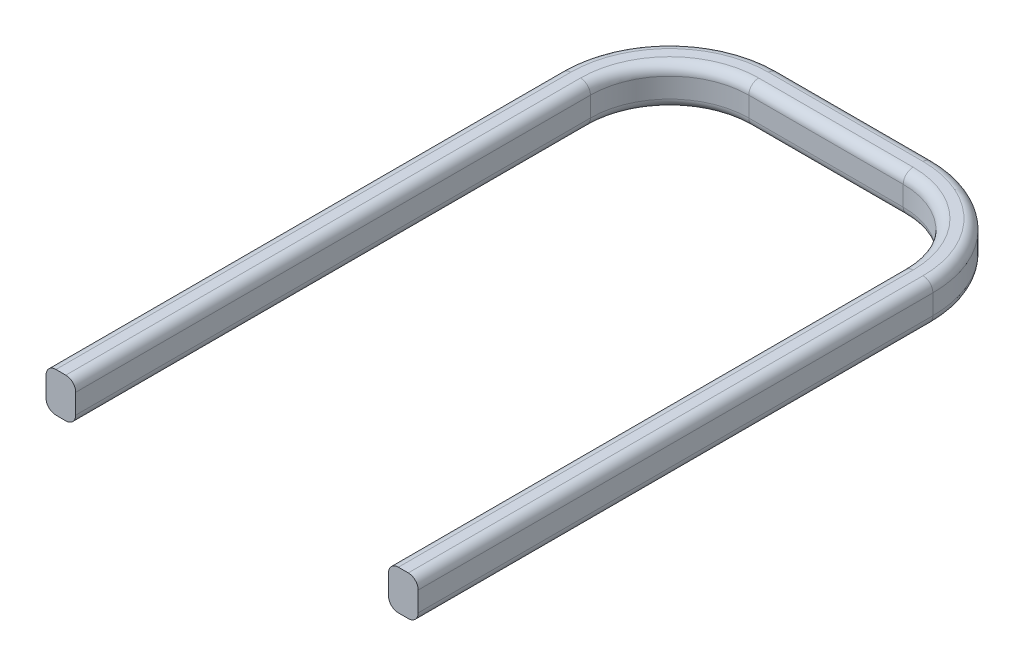
ISO-10303-21;
HEADER;
FILE_DESCRIPTION(('STEP AP214'),'2;1');
FILE_NAME('part.step','',(''),(''),'','','');
FILE_SCHEMA(('AUTOMOTIVE_DESIGN { 1 0 10303 214 1 1 1 1 }'));
ENDSEC;
DATA;
#1=APPLICATION_CONTEXT('core data for automotive mechanical design processes');
#2=APPLICATION_PROTOCOL_DEFINITION('international standard','automotive_design',2000,#1);
#3=PRODUCT_CONTEXT('',#1,'mechanical');
#4=PRODUCT('Part','Part','',(#3));
#5=PRODUCT_RELATED_PRODUCT_CATEGORY('part','',(#4));
#6=PRODUCT_DEFINITION_FORMATION('','',#4);
#7=PRODUCT_DEFINITION_CONTEXT('part definition',#1,'design');
#8=PRODUCT_DEFINITION('design','',#6,#7);
#9=PRODUCT_DEFINITION_SHAPE('','',#8);
#10=(LENGTH_UNIT() NAMED_UNIT(*) SI_UNIT(.MILLI.,.METRE.));
#11=(NAMED_UNIT(*) PLANE_ANGLE_UNIT() SI_UNIT($,.RADIAN.));
#12=(NAMED_UNIT(*) SI_UNIT($,.STERADIAN.) SOLID_ANGLE_UNIT());
#13=UNCERTAINTY_MEASURE_WITH_UNIT(LENGTH_MEASURE(1.E-05),#10,'distance_accuracy_value','');
#14=(GEOMETRIC_REPRESENTATION_CONTEXT(3) GLOBAL_UNCERTAINTY_ASSIGNED_CONTEXT((#13)) GLOBAL_UNIT_ASSIGNED_CONTEXT((#10,
#11,#12)) REPRESENTATION_CONTEXT('',''));
#15=CARTESIAN_POINT('',(0.,0.,0.));
#16=DIRECTION('',(0.,0.,1.));
#17=DIRECTION('',(1.,0.,0.));
#18=AXIS2_PLACEMENT_3D('',#15,#16,#17);
#19=CARTESIAN_POINT('',(-4.7,1.,0.));
#20=DIRECTION('',(0.,0.,-1.));
#21=DIRECTION('',(-1.,0.,0.));
#22=AXIS2_PLACEMENT_3D('',#19,#20,#21);
#23=PLANE('',#22);
#24=DIRECTION('',(1.,0.,0.));
#25=VECTOR('',#24,1.);
#26=CARTESIAN_POINT('',(-4.7,0.,0.));
#27=LINE('',#26,#25);
#28=CARTESIAN_POINT('',(-4.45,0.,0.));
#29=VERTEX_POINT('',#28);
#30=CARTESIAN_POINT('',(-4.2,0.,0.));
#31=VERTEX_POINT('',#30);
#32=EDGE_CURVE('E313',#29,#31,#27,.T.);
#33=ORIENTED_EDGE('',*,*,#32,.T.);
#34=CARTESIAN_POINT('',(-4.2,0.25,0.));
#35=DIRECTION('',(0.,0.,-1.));
#36=DIRECTION('',(-1.,0.,0.));
#37=AXIS2_PLACEMENT_3D('',#34,#35,#36);
#38=CIRCLE('',#37,0.25);
#39=CARTESIAN_POINT('',(-3.95,0.25,0.));
#40=VERTEX_POINT('',#39);
#41=EDGE_CURVE('E207',#31,#40,#38,.F.);
#42=ORIENTED_EDGE('',*,*,#41,.T.);
#43=DIRECTION('',(0.,-1.,0.));
#44=VECTOR('',#43,1.);
#45=CARTESIAN_POINT('',(-3.95,1.,0.));
#46=LINE('',#45,#44);
#47=CARTESIAN_POINT('',(-3.95,0.75,0.));
#48=VERTEX_POINT('',#47);
#49=EDGE_CURVE('E218',#48,#40,#46,.T.);
#50=ORIENTED_EDGE('',*,*,#49,.F.);
#51=CARTESIAN_POINT('',(-4.2,0.75,0.));
#52=DIRECTION('',(0.,0.,-1.));
#53=DIRECTION('',(-1.,0.,0.));
#54=AXIS2_PLACEMENT_3D('',#51,#52,#53);
#55=CIRCLE('',#54,0.25);
#56=CARTESIAN_POINT('',(-4.2,1.,0.));
#57=VERTEX_POINT('',#56);
#58=EDGE_CURVE('E226',#48,#57,#55,.F.);
#59=ORIENTED_EDGE('',*,*,#58,.T.);
#60=DIRECTION('',(1.,0.,0.));
#61=VECTOR('',#60,1.);
#62=CARTESIAN_POINT('',(-4.7,1.,0.));
#63=LINE('',#62,#61);
#64=CARTESIAN_POINT('',(-4.45,1.,0.));
#65=VERTEX_POINT('',#64);
#66=EDGE_CURVE('E324',#65,#57,#63,.T.);
#67=ORIENTED_EDGE('',*,*,#66,.F.);
#68=CARTESIAN_POINT('',(-4.45,0.75,0.));
#69=DIRECTION('',(0.,0.,-1.));
#70=DIRECTION('',(-1.,0.,0.));
#71=AXIS2_PLACEMENT_3D('',#68,#69,#70);
#72=CIRCLE('',#71,0.25);
#73=CARTESIAN_POINT('',(-4.7,0.75,0.));
#74=VERTEX_POINT('',#73);
#75=EDGE_CURVE('E380',#65,#74,#72,.F.);
#76=ORIENTED_EDGE('',*,*,#75,.T.);
#77=DIRECTION('',(0.,-1.,0.));
#78=VECTOR('',#77,1.);
#79=CARTESIAN_POINT('',(-4.7,1.,0.));
#80=LINE('',#79,#78);
#81=CARTESIAN_POINT('',(-4.7,0.25,0.));
#82=VERTEX_POINT('',#81);
#83=EDGE_CURVE('E330',#74,#82,#80,.T.);
#84=ORIENTED_EDGE('',*,*,#83,.T.);
#85=CARTESIAN_POINT('',(-4.45,0.25,0.));
#86=DIRECTION('',(0.,0.,-1.));
#87=DIRECTION('',(-1.,0.,0.));
#88=AXIS2_PLACEMENT_3D('',#85,#86,#87);
#89=CIRCLE('',#88,0.25);
#90=EDGE_CURVE('E382',#82,#29,#89,.F.);
#91=ORIENTED_EDGE('',*,*,#90,.T.);
#92=EDGE_LOOP('',(#33,#42,#50,#59,#67,#76,#84,#91));
#93=FACE_BOUND('',#92,.T.);
#94=ADVANCED_FACE('F32',(#93),#23,.F.);
#95=CARTESIAN_POINT('',(-3.95,1.,0.));
#96=DIRECTION('',(-1.,0.,0.));
#97=DIRECTION('',(0.,0.,1.));
#98=AXIS2_PLACEMENT_3D('',#95,#96,#97);
#99=PLANE('',#98);
#100=ORIENTED_EDGE('',*,*,#49,.T.);
#101=DIRECTION('',(0.,0.,-1.));
#102=VECTOR('',#101,1.);
#103=CARTESIAN_POINT('',(-3.95,0.25,-13.));
#104=LINE('',#103,#102);
#105=CARTESIAN_POINT('',(-3.95,0.25,-13.));
#106=VERTEX_POINT('',#105);
#107=EDGE_CURVE('E217',#40,#106,#104,.T.);
#108=ORIENTED_EDGE('',*,*,#107,.T.);
#109=DIRECTION('',(0.,-1.,0.));
#110=VECTOR('',#109,1.);
#111=CARTESIAN_POINT('',(-3.95,1.,-13.));
#112=LINE('',#111,#110);
#113=CARTESIAN_POINT('',(-3.95,0.75,-13.));
#114=VERTEX_POINT('',#113);
#115=EDGE_CURVE('E199',#114,#106,#112,.T.);
#116=ORIENTED_EDGE('',*,*,#115,.F.);
#117=DIRECTION('',(0.,0.,-1.));
#118=VECTOR('',#117,1.);
#119=CARTESIAN_POINT('',(-3.95,0.75,0.));
#120=LINE('',#119,#118);
#121=EDGE_CURVE('E214',#114,#48,#120,.F.);
#122=ORIENTED_EDGE('',*,*,#121,.T.);
#123=EDGE_LOOP('',(#100,#108,#116,#122));
#124=FACE_BOUND('',#123,.T.);
#125=ADVANCED_FACE('F213',(#124),#99,.F.);
#126=CARTESIAN_POINT('',(-1.95,1.,-13.));
#127=DIRECTION('',(0.,-1.,0.));
#128=DIRECTION('',(0.,0.,-1.));
#129=AXIS2_PLACEMENT_3D('',#126,#127,#128);
#130=CYLINDRICAL_SURFACE('',#129,2.);
#131=ORIENTED_EDGE('',*,*,#115,.T.);
#132=CARTESIAN_POINT('',(-1.95,0.25,-13.));
#133=DIRECTION('',(0.,-1.,0.));
#134=DIRECTION('',(0.,0.,-1.));
#135=AXIS2_PLACEMENT_3D('',#132,#133,#134);
#136=CIRCLE('',#135,2.);
#137=CARTESIAN_POINT('',(-1.95,0.25,-15.));
#138=VERTEX_POINT('',#137);
#139=EDGE_CURVE('E206',#106,#138,#136,.T.);
#140=ORIENTED_EDGE('',*,*,#139,.T.);
#141=DIRECTION('',(0.,-1.,0.));
#142=VECTOR('',#141,1.);
#143=CARTESIAN_POINT('',(-1.95,1.,-15.));
#144=LINE('',#143,#142);
#145=CARTESIAN_POINT('',(-1.95,0.75,-15.));
#146=VERTEX_POINT('',#145);
#147=EDGE_CURVE('E201',#146,#138,#144,.T.);
#148=ORIENTED_EDGE('',*,*,#147,.F.);
#149=CARTESIAN_POINT('',(-1.95,0.75,-13.));
#150=DIRECTION('',(0.,-1.,0.));
#151=DIRECTION('',(0.,0.,-1.));
#152=AXIS2_PLACEMENT_3D('',#149,#150,#151);
#153=CIRCLE('',#152,2.);
#154=EDGE_CURVE('E196',#146,#114,#153,.F.);
#155=ORIENTED_EDGE('',*,*,#154,.T.);
#156=EDGE_LOOP('',(#131,#140,#148,#155));
#157=FACE_BOUND('',#156,.T.);
#158=ADVANCED_FACE('F198',(#157),#130,.F.);
#159=CARTESIAN_POINT('',(-1.94999999999999,1.,-15.));
#160=DIRECTION('',(0.,0.,-1.));
#161=DIRECTION('',(-1.,0.,0.));
#162=AXIS2_PLACEMENT_3D('',#159,#160,#161);
#163=PLANE('',#162);
#164=ORIENTED_EDGE('',*,*,#147,.T.);
#165=DIRECTION('',(1.,0.,0.));
#166=VECTOR('',#165,1.);
#167=CARTESIAN_POINT('',(1.94999999999999,0.25,-15.));
#168=LINE('',#167,#166);
#169=CARTESIAN_POINT('',(1.94999999999999,0.25,-15.));
#170=VERTEX_POINT('',#169);
#171=EDGE_CURVE('E388',#138,#170,#168,.T.);
#172=ORIENTED_EDGE('',*,*,#171,.T.);
#173=DIRECTION('',(0.,-1.,0.));
#174=VECTOR('',#173,1.);
#175=CARTESIAN_POINT('',(1.94999999999999,1.,-15.));
#176=LINE('',#175,#174);
#177=CARTESIAN_POINT('',(1.94999999999999,0.75,-15.));
#178=VERTEX_POINT('',#177);
#179=EDGE_CURVE('E353',#178,#170,#176,.T.);
#180=ORIENTED_EDGE('',*,*,#179,.F.);
#181=DIRECTION('',(1.,0.,0.));
#182=VECTOR('',#181,1.);
#183=CARTESIAN_POINT('',(-1.94999999999999,0.75,-15.));
#184=LINE('',#183,#182);
#185=EDGE_CURVE('E386',#178,#146,#184,.F.);
#186=ORIENTED_EDGE('',*,*,#185,.T.);
#187=EDGE_LOOP('',(#164,#172,#180,#186));
#188=FACE_BOUND('',#187,.T.);
#189=ADVANCED_FACE('F459',(#188),#163,.F.);
#190=CARTESIAN_POINT('',(1.95,1.,-13.));
#191=DIRECTION('',(0.,-1.,0.));
#192=DIRECTION('',(0.,0.,-1.));
#193=AXIS2_PLACEMENT_3D('',#190,#191,#192);
#194=CYLINDRICAL_SURFACE('',#193,2.);
#195=ORIENTED_EDGE('',*,*,#179,.T.);
#196=CARTESIAN_POINT('',(1.95,0.25,-13.));
#197=DIRECTION('',(0.,-1.,0.));
#198=DIRECTION('',(0.,0.,-1.));
#199=AXIS2_PLACEMENT_3D('',#196,#197,#198);
#200=CIRCLE('',#199,2.);
#201=CARTESIAN_POINT('',(3.95,0.25,-13.));
#202=VERTEX_POINT('',#201);
#203=EDGE_CURVE('E392',#170,#202,#200,.T.);
#204=ORIENTED_EDGE('',*,*,#203,.T.);
#205=DIRECTION('',(0.,-1.,0.));
#206=VECTOR('',#205,1.);
#207=CARTESIAN_POINT('',(3.95,1.,-13.));
#208=LINE('',#207,#206);
#209=CARTESIAN_POINT('',(3.95,0.75,-13.));
#210=VERTEX_POINT('',#209);
#211=EDGE_CURVE('E350',#210,#202,#208,.T.);
#212=ORIENTED_EDGE('',*,*,#211,.F.);
#213=CARTESIAN_POINT('',(1.95,0.75,-13.));
#214=DIRECTION('',(0.,-1.,0.));
#215=DIRECTION('',(0.,0.,-1.));
#216=AXIS2_PLACEMENT_3D('',#213,#214,#215);
#217=CIRCLE('',#216,2.);
#218=EDGE_CURVE('E390',#210,#178,#217,.F.);
#219=ORIENTED_EDGE('',*,*,#218,.T.);
#220=EDGE_LOOP('',(#195,#204,#212,#219));
#221=FACE_BOUND('',#220,.T.);
#222=ADVANCED_FACE('F468',(#221),#194,.F.);
#223=CARTESIAN_POINT('',(3.95,1.,-13.));
#224=DIRECTION('',(1.,0.,0.));
#225=DIRECTION('',(0.,0.,-1.));
#226=AXIS2_PLACEMENT_3D('',#223,#224,#225);
#227=PLANE('',#226);
#228=ORIENTED_EDGE('',*,*,#211,.T.);
#229=DIRECTION('',(0.,0.,1.));
#230=VECTOR('',#229,1.);
#231=CARTESIAN_POINT('',(3.95,0.25,0.));
#232=LINE('',#231,#230);
#233=CARTESIAN_POINT('',(3.95,0.25,0.));
#234=VERTEX_POINT('',#233);
#235=EDGE_CURVE('E433',#202,#234,#232,.T.);
#236=ORIENTED_EDGE('',*,*,#235,.T.);
#237=DIRECTION('',(0.,-1.,0.));
#238=VECTOR('',#237,1.);
#239=CARTESIAN_POINT('',(3.95,1.,0.));
#240=LINE('',#239,#238);
#241=CARTESIAN_POINT('',(3.95,0.75,0.));
#242=VERTEX_POINT('',#241);
#243=EDGE_CURVE('E347',#242,#234,#240,.T.);
#244=ORIENTED_EDGE('',*,*,#243,.F.);
#245=DIRECTION('',(0.,0.,1.));
#246=VECTOR('',#245,1.);
#247=CARTESIAN_POINT('',(3.95,0.75,-13.));
#248=LINE('',#247,#246);
#249=EDGE_CURVE('E431',#242,#210,#248,.F.);
#250=ORIENTED_EDGE('',*,*,#249,.T.);
#251=EDGE_LOOP('',(#228,#236,#244,#250));
#252=FACE_BOUND('',#251,.T.);
#253=ADVANCED_FACE('F723',(#252),#227,.F.);
#254=CARTESIAN_POINT('',(3.95,1.,0.));
#255=DIRECTION('',(0.,0.,-1.));
#256=DIRECTION('',(-1.,0.,0.));
#257=AXIS2_PLACEMENT_3D('',#254,#255,#256);
#258=PLANE('',#257);
#259=ORIENTED_EDGE('',*,*,#243,.T.);
#260=CARTESIAN_POINT('',(4.2,0.25,0.));
#261=DIRECTION('',(0.,0.,-1.));
#262=DIRECTION('',(-1.,0.,0.));
#263=AXIS2_PLACEMENT_3D('',#260,#261,#262);
#264=CIRCLE('',#263,0.25);
#265=CARTESIAN_POINT('',(4.2,0.,0.));
#266=VERTEX_POINT('',#265);
#267=EDGE_CURVE('E440',#234,#266,#264,.F.);
#268=ORIENTED_EDGE('',*,*,#267,.T.);
#269=DIRECTION('',(1.,0.,0.));
#270=VECTOR('',#269,1.);
#271=CARTESIAN_POINT('',(3.95,0.,0.));
#272=LINE('',#271,#270);
#273=CARTESIAN_POINT('',(4.45,0.,0.));
#274=VERTEX_POINT('',#273);
#275=EDGE_CURVE('E319',#266,#274,#272,.T.);
#276=ORIENTED_EDGE('',*,*,#275,.T.);
#277=CARTESIAN_POINT('',(4.45,0.25,0.));
#278=DIRECTION('',(0.,0.,-1.));
#279=DIRECTION('',(-1.,0.,0.));
#280=AXIS2_PLACEMENT_3D('',#277,#278,#279);
#281=CIRCLE('',#280,0.25);
#282=CARTESIAN_POINT('',(4.7,0.25,0.));
#283=VERTEX_POINT('',#282);
#284=EDGE_CURVE('E49',#274,#283,#281,.F.);
#285=ORIENTED_EDGE('',*,*,#284,.T.);
#286=DIRECTION('',(0.,-1.,0.));
#287=VECTOR('',#286,1.);
#288=CARTESIAN_POINT('',(4.7,1.,0.));
#289=LINE('',#288,#287);
#290=CARTESIAN_POINT('',(4.7,0.75,0.));
#291=VERTEX_POINT('',#290);
#292=EDGE_CURVE('E345',#291,#283,#289,.T.);
#293=ORIENTED_EDGE('',*,*,#292,.F.);
#294=CARTESIAN_POINT('',(4.45,0.75,0.));
#295=DIRECTION('',(0.,0.,-1.));
#296=DIRECTION('',(-1.,0.,0.));
#297=AXIS2_PLACEMENT_3D('',#294,#295,#296);
#298=CIRCLE('',#297,0.25);
#299=CARTESIAN_POINT('',(4.45,1.,0.));
#300=VERTEX_POINT('',#299);
#301=EDGE_CURVE('E437',#291,#300,#298,.F.);
#302=ORIENTED_EDGE('',*,*,#301,.T.);
#303=DIRECTION('',(1.,0.,0.));
#304=VECTOR('',#303,1.);
#305=CARTESIAN_POINT('',(3.95,1.,0.));
#306=LINE('',#305,#304);
#307=CARTESIAN_POINT('',(4.2,1.,0.));
#308=VERTEX_POINT('',#307);
#309=EDGE_CURVE('E327',#308,#300,#306,.T.);
#310=ORIENTED_EDGE('',*,*,#309,.F.);
#311=CARTESIAN_POINT('',(4.2,0.75,0.));
#312=DIRECTION('',(0.,0.,-1.));
#313=DIRECTION('',(-1.,0.,0.));
#314=AXIS2_PLACEMENT_3D('',#311,#312,#313);
#315=CIRCLE('',#314,0.25);
#316=EDGE_CURVE('E435',#308,#242,#315,.F.);
#317=ORIENTED_EDGE('',*,*,#316,.T.);
#318=EDGE_LOOP('',(#259,#268,#276,#285,#293,#302,#310,#317));
#319=FACE_BOUND('',#318,.T.);
#320=ADVANCED_FACE('F443',(#319),#258,.F.);
#321=CARTESIAN_POINT('',(4.7,1.,-13.));
#322=DIRECTION('',(-1.,0.,0.));
#323=DIRECTION('',(0.,0.,1.));
#324=AXIS2_PLACEMENT_3D('',#321,#322,#323);
#325=PLANE('',#324);
#326=ORIENTED_EDGE('',*,*,#292,.T.);
#327=DIRECTION('',(0.,0.,-1.));
#328=VECTOR('',#327,1.);
#329=CARTESIAN_POINT('',(4.7,0.25,-13.));
#330=LINE('',#329,#328);
#331=CARTESIAN_POINT('',(4.7,0.25,-13.));
#332=VERTEX_POINT('',#331);
#333=EDGE_CURVE('E11',#283,#332,#330,.T.);
#334=ORIENTED_EDGE('',*,*,#333,.T.);
#335=DIRECTION('',(0.,-1.,0.));
#336=VECTOR('',#335,1.);
#337=CARTESIAN_POINT('',(4.7,1.,-13.));
#338=LINE('',#337,#336);
#339=CARTESIAN_POINT('',(4.7,0.75,-13.));
#340=VERTEX_POINT('',#339);
#341=EDGE_CURVE('E342',#340,#332,#338,.T.);
#342=ORIENTED_EDGE('',*,*,#341,.F.);
#343=DIRECTION('',(0.,0.,-1.));
#344=VECTOR('',#343,1.);
#345=CARTESIAN_POINT('',(4.7,0.75,-13.));
#346=LINE('',#345,#344);
#347=EDGE_CURVE('E41',#340,#291,#346,.F.);
#348=ORIENTED_EDGE('',*,*,#347,.T.);
#349=EDGE_LOOP('',(#326,#334,#342,#348));
#350=FACE_BOUND('',#349,.T.);
#351=ADVANCED_FACE('F708',(#350),#325,.F.);
#352=CARTESIAN_POINT('',(1.95,1.,-13.));
#353=DIRECTION('',(0.,-1.,0.));
#354=DIRECTION('',(0.,0.,-1.));
#355=AXIS2_PLACEMENT_3D('',#352,#353,#354);
#356=CYLINDRICAL_SURFACE('',#355,2.75);
#357=ORIENTED_EDGE('',*,*,#341,.T.);
#358=CARTESIAN_POINT('',(1.95,0.25,-13.));
#359=DIRECTION('',(0.,-1.,0.));
#360=DIRECTION('',(0.,0.,-1.));
#361=AXIS2_PLACEMENT_3D('',#358,#359,#360);
#362=CIRCLE('',#361,2.75);
#363=CARTESIAN_POINT('',(1.94999999999999,0.25,-15.75));
#364=VERTEX_POINT('',#363);
#365=EDGE_CURVE('E409',#332,#364,#362,.F.);
#366=ORIENTED_EDGE('',*,*,#365,.T.);
#367=DIRECTION('',(0.,-1.,0.));
#368=VECTOR('',#367,1.);
#369=CARTESIAN_POINT('',(1.94999999999999,1.,-15.75));
#370=LINE('',#369,#368);
#371=CARTESIAN_POINT('',(1.94999999999999,0.75,-15.75));
#372=VERTEX_POINT('',#371);
#373=EDGE_CURVE('E339',#372,#364,#370,.T.);
#374=ORIENTED_EDGE('',*,*,#373,.F.);
#375=CARTESIAN_POINT('',(1.95,0.75,-13.));
#376=DIRECTION('',(0.,-1.,0.));
#377=DIRECTION('',(0.,0.,-1.));
#378=AXIS2_PLACEMENT_3D('',#375,#376,#377);
#379=CIRCLE('',#378,2.75);
#380=EDGE_CURVE('E407',#372,#340,#379,.T.);
#381=ORIENTED_EDGE('',*,*,#380,.T.);
#382=EDGE_LOOP('',(#357,#366,#374,#381));
#383=FACE_BOUND('',#382,.T.);
#384=ADVANCED_FACE('F504',(#383),#356,.T.);
#385=CARTESIAN_POINT('',(-1.94999999999998,1.,-15.75));
#386=DIRECTION('',(0.,0.,1.));
#387=DIRECTION('',(1.,0.,0.));
#388=AXIS2_PLACEMENT_3D('',#385,#386,#387);
#389=PLANE('',#388);
#390=ORIENTED_EDGE('',*,*,#373,.T.);
#391=DIRECTION('',(-1.,0.,0.));
#392=VECTOR('',#391,1.);
#393=CARTESIAN_POINT('',(-1.94999999999998,0.25,-15.75));
#394=LINE('',#393,#392);
#395=CARTESIAN_POINT('',(-1.94999999999998,0.25,-15.75));
#396=VERTEX_POINT('',#395);
#397=EDGE_CURVE('E405',#364,#396,#394,.T.);
#398=ORIENTED_EDGE('',*,*,#397,.T.);
#399=DIRECTION('',(0.,-1.,0.));
#400=VECTOR('',#399,1.);
#401=CARTESIAN_POINT('',(-1.94999999999998,1.,-15.75));
#402=LINE('',#401,#400);
#403=CARTESIAN_POINT('',(-1.94999999999998,0.75,-15.75));
#404=VERTEX_POINT('',#403);
#405=EDGE_CURVE('E336',#404,#396,#402,.T.);
#406=ORIENTED_EDGE('',*,*,#405,.F.);
#407=DIRECTION('',(-1.,0.,0.));
#408=VECTOR('',#407,1.);
#409=CARTESIAN_POINT('',(-1.94999999999998,0.75,-15.75));
#410=LINE('',#409,#408);
#411=EDGE_CURVE('E403',#404,#372,#410,.F.);
#412=ORIENTED_EDGE('',*,*,#411,.T.);
#413=EDGE_LOOP('',(#390,#398,#406,#412));
#414=FACE_BOUND('',#413,.T.);
#415=ADVANCED_FACE('F495',(#414),#389,.F.);
#416=CARTESIAN_POINT('',(-1.95,1.,-13.));
#417=DIRECTION('',(0.,-1.,0.));
#418=DIRECTION('',(0.,0.,-1.));
#419=AXIS2_PLACEMENT_3D('',#416,#417,#418);
#420=CYLINDRICAL_SURFACE('',#419,2.75);
#421=ORIENTED_EDGE('',*,*,#405,.T.);
#422=CARTESIAN_POINT('',(-1.95,0.25,-13.));
#423=DIRECTION('',(0.,-1.,0.));
#424=DIRECTION('',(0.,0.,-1.));
#425=AXIS2_PLACEMENT_3D('',#422,#423,#424);
#426=CIRCLE('',#425,2.75);
#427=CARTESIAN_POINT('',(-4.7,0.25,-13.));
#428=VERTEX_POINT('',#427);
#429=EDGE_CURVE('E401',#396,#428,#426,.F.);
#430=ORIENTED_EDGE('',*,*,#429,.T.);
#431=DIRECTION('',(0.,-1.,0.));
#432=VECTOR('',#431,1.);
#433=CARTESIAN_POINT('',(-4.7,1.,-13.));
#434=LINE('',#433,#432);
#435=CARTESIAN_POINT('',(-4.7,0.75,-13.));
#436=VERTEX_POINT('',#435);
#437=EDGE_CURVE('E333',#436,#428,#434,.T.);
#438=ORIENTED_EDGE('',*,*,#437,.F.);
#439=CARTESIAN_POINT('',(-1.95,0.75,-13.));
#440=DIRECTION('',(0.,-1.,0.));
#441=DIRECTION('',(0.,0.,-1.));
#442=AXIS2_PLACEMENT_3D('',#439,#440,#441);
#443=CIRCLE('',#442,2.75);
#444=EDGE_CURVE('E399',#436,#404,#443,.T.);
#445=ORIENTED_EDGE('',*,*,#444,.T.);
#446=EDGE_LOOP('',(#421,#430,#438,#445));
#447=FACE_BOUND('',#446,.T.);
#448=ADVANCED_FACE('F497',(#447),#420,.T.);
#449=CARTESIAN_POINT('',(-4.7,1.,0.));
#450=DIRECTION('',(1.,0.,0.));
#451=DIRECTION('',(0.,0.,-1.));
#452=AXIS2_PLACEMENT_3D('',#449,#450,#451);
#453=PLANE('',#452);
#454=ORIENTED_EDGE('',*,*,#437,.T.);
#455=DIRECTION('',(0.,0.,1.));
#456=VECTOR('',#455,1.);
#457=CARTESIAN_POINT('',(-4.7,0.25,0.));
#458=LINE('',#457,#456);
#459=EDGE_CURVE('E396',#428,#82,#458,.T.);
#460=ORIENTED_EDGE('',*,*,#459,.T.);
#461=ORIENTED_EDGE('',*,*,#83,.F.);
#462=DIRECTION('',(0.,0.,1.));
#463=VECTOR('',#462,1.);
#464=CARTESIAN_POINT('',(-4.7,0.75,0.));
#465=LINE('',#464,#463);
#466=EDGE_CURVE('E394',#74,#436,#465,.F.);
#467=ORIENTED_EDGE('',*,*,#466,.T.);
#468=EDGE_LOOP('',(#454,#460,#461,#467));
#469=FACE_BOUND('',#468,.T.);
#470=ADVANCED_FACE('F484',(#469),#453,.F.);
#471=CARTESIAN_POINT('',(-1.95,1.,-13.));
#472=DIRECTION('',(0.,-1.,0.));
#473=DIRECTION('',(0.,0.,-1.));
#474=AXIS2_PLACEMENT_3D('',#471,#472,#473);
#475=PLANE('',#474);
#476=CARTESIAN_POINT('',(-1.95,1.,-13.));
#477=DIRECTION('',(0.,-1.,0.));
#478=DIRECTION('',(0.,0.,-1.));
#479=AXIS2_PLACEMENT_3D('',#476,#477,#478);
#480=CIRCLE('',#479,2.5);
#481=CARTESIAN_POINT('',(-1.94999999999998,1.,-15.5));
#482=VERTEX_POINT('',#481);
#483=CARTESIAN_POINT('',(-4.45,1.,-13.));
#484=VERTEX_POINT('',#483);
#485=EDGE_CURVE('E426',#482,#484,#480,.F.);
#486=ORIENTED_EDGE('',*,*,#485,.T.);
#487=DIRECTION('',(0.,0.,1.));
#488=VECTOR('',#487,1.);
#489=CARTESIAN_POINT('',(-4.45,1.,-13.));
#490=LINE('',#489,#488);
#491=EDGE_CURVE('E428',#484,#65,#490,.T.);
#492=ORIENTED_EDGE('',*,*,#491,.T.);
#493=ORIENTED_EDGE('',*,*,#66,.T.);
#494=DIRECTION('',(0.,0.,-1.));
#495=VECTOR('',#494,1.);
#496=CARTESIAN_POINT('',(-4.2,1.,-13.));
#497=LINE('',#496,#495);
#498=CARTESIAN_POINT('',(-4.2,1.,-13.));
#499=VERTEX_POINT('',#498);
#500=EDGE_CURVE('E418',#57,#499,#497,.T.);
#501=ORIENTED_EDGE('',*,*,#500,.T.);
#502=CARTESIAN_POINT('',(-1.95,1.,-13.));
#503=DIRECTION('',(0.,-1.,0.));
#504=DIRECTION('',(0.,0.,-1.));
#505=AXIS2_PLACEMENT_3D('',#502,#503,#504);
#506=CIRCLE('',#505,2.25);
#507=CARTESIAN_POINT('',(-1.95,1.,-15.25));
#508=VERTEX_POINT('',#507);
#509=EDGE_CURVE('E229',#499,#508,#506,.T.);
#510=ORIENTED_EDGE('',*,*,#509,.T.);
#511=DIRECTION('',(1.,0.,0.));
#512=VECTOR('',#511,1.);
#513=CARTESIAN_POINT('',(-1.95,1.,-15.25));
#514=LINE('',#513,#512);
#515=CARTESIAN_POINT('',(1.94999999999999,1.,-15.25));
#516=VERTEX_POINT('',#515);
#517=EDGE_CURVE('E415',#508,#516,#514,.T.);
#518=ORIENTED_EDGE('',*,*,#517,.T.);
#519=CARTESIAN_POINT('',(1.95,1.,-13.));
#520=DIRECTION('',(0.,-1.,0.));
#521=DIRECTION('',(0.,0.,-1.));
#522=AXIS2_PLACEMENT_3D('',#519,#520,#521);
#523=CIRCLE('',#522,2.25);
#524=CARTESIAN_POINT('',(4.2,1.,-13.));
#525=VERTEX_POINT('',#524);
#526=EDGE_CURVE('E413',#516,#525,#523,.T.);
#527=ORIENTED_EDGE('',*,*,#526,.T.);
#528=DIRECTION('',(0.,0.,1.));
#529=VECTOR('',#528,1.);
#530=CARTESIAN_POINT('',(4.2,1.,-13.));
#531=LINE('',#530,#529);
#532=EDGE_CURVE('E411',#525,#308,#531,.T.);
#533=ORIENTED_EDGE('',*,*,#532,.T.);
#534=ORIENTED_EDGE('',*,*,#309,.T.);
#535=DIRECTION('',(0.,0.,-1.));
#536=VECTOR('',#535,1.);
#537=CARTESIAN_POINT('',(4.45,1.,-13.));
#538=LINE('',#537,#536);
#539=CARTESIAN_POINT('',(4.45,1.,-13.));
#540=VERTEX_POINT('',#539);
#541=EDGE_CURVE('E420',#300,#540,#538,.T.);
#542=ORIENTED_EDGE('',*,*,#541,.T.);
#543=CARTESIAN_POINT('',(1.95,1.,-13.));
#544=DIRECTION('',(0.,-1.,0.));
#545=DIRECTION('',(0.,0.,-1.));
#546=AXIS2_PLACEMENT_3D('',#543,#544,#545);
#547=CIRCLE('',#546,2.5);
#548=CARTESIAN_POINT('',(1.94999999999999,1.,-15.5));
#549=VERTEX_POINT('',#548);
#550=EDGE_CURVE('E422',#540,#549,#547,.F.);
#551=ORIENTED_EDGE('',*,*,#550,.T.);
#552=DIRECTION('',(-1.,0.,0.));
#553=VECTOR('',#552,1.);
#554=CARTESIAN_POINT('',(-1.95,1.,-15.5));
#555=LINE('',#554,#553);
#556=EDGE_CURVE('E424',#549,#482,#555,.T.);
#557=ORIENTED_EDGE('',*,*,#556,.T.);
#558=EDGE_LOOP('',(#486,#492,#493,#501,#510,#518,#527,#533,#534,#542,#551,#557));
#559=FACE_BOUND('',#558,.T.);
#560=ADVANCED_FACE('F463',(#559),#475,.F.);
#561=CARTESIAN_POINT('',(-1.95,0.,-13.));
#562=DIRECTION('',(0.,-1.,0.));
#563=DIRECTION('',(0.,0.,-1.));
#564=AXIS2_PLACEMENT_3D('',#561,#562,#563);
#565=PLANE('',#564);
#566=CARTESIAN_POINT('',(-1.95,0.,-13.));
#567=DIRECTION('',(0.,-1.,0.));
#568=DIRECTION('',(0.,0.,-1.));
#569=AXIS2_PLACEMENT_3D('',#566,#567,#568);
#570=CIRCLE('',#569,2.25);
#571=CARTESIAN_POINT('',(-1.95,0.,-15.25));
#572=VERTEX_POINT('',#571);
#573=CARTESIAN_POINT('',(-4.2,0.,-13.));
#574=VERTEX_POINT('',#573);
#575=EDGE_CURVE('E375',#572,#574,#570,.F.);
#576=ORIENTED_EDGE('',*,*,#575,.T.);
#577=DIRECTION('',(0.,0.,-1.));
#578=VECTOR('',#577,1.);
#579=CARTESIAN_POINT('',(-4.2,0.,0.));
#580=LINE('',#579,#578);
#581=EDGE_CURVE('E377',#574,#31,#580,.F.);
#582=ORIENTED_EDGE('',*,*,#581,.T.);
#583=ORIENTED_EDGE('',*,*,#32,.F.);
#584=DIRECTION('',(0.,0.,1.));
#585=VECTOR('',#584,1.);
#586=CARTESIAN_POINT('',(-4.45,0.,-13.));
#587=LINE('',#586,#585);
#588=CARTESIAN_POINT('',(-4.45,0.,-13.));
#589=VERTEX_POINT('',#588);
#590=EDGE_CURVE('E367',#29,#589,#587,.F.);
#591=ORIENTED_EDGE('',*,*,#590,.T.);
#592=CARTESIAN_POINT('',(-1.95,0.,-13.));
#593=DIRECTION('',(0.,-1.,0.));
#594=DIRECTION('',(0.,0.,-1.));
#595=AXIS2_PLACEMENT_3D('',#592,#593,#594);
#596=CIRCLE('',#595,2.5);
#597=CARTESIAN_POINT('',(-1.94999999999998,0.,-15.5));
#598=VERTEX_POINT('',#597);
#599=EDGE_CURVE('E365',#589,#598,#596,.T.);
#600=ORIENTED_EDGE('',*,*,#599,.T.);
#601=DIRECTION('',(-1.,0.,0.));
#602=VECTOR('',#601,1.);
#603=CARTESIAN_POINT('',(1.94999999999999,0.,-15.5));
#604=LINE('',#603,#602);
#605=CARTESIAN_POINT('',(1.94999999999999,0.,-15.5));
#606=VERTEX_POINT('',#605);
#607=EDGE_CURVE('E363',#598,#606,#604,.F.);
#608=ORIENTED_EDGE('',*,*,#607,.T.);
#609=CARTESIAN_POINT('',(1.95,0.,-13.));
#610=DIRECTION('',(0.,-1.,0.));
#611=DIRECTION('',(0.,0.,-1.));
#612=AXIS2_PLACEMENT_3D('',#609,#610,#611);
#613=CIRCLE('',#612,2.5);
#614=CARTESIAN_POINT('',(4.45,0.,-13.));
#615=VERTEX_POINT('',#614);
#616=EDGE_CURVE('E361',#606,#615,#613,.T.);
#617=ORIENTED_EDGE('',*,*,#616,.T.);
#618=DIRECTION('',(0.,0.,-1.));
#619=VECTOR('',#618,1.);
#620=CARTESIAN_POINT('',(4.45,0.,0.));
#621=LINE('',#620,#619);
#622=EDGE_CURVE('E359',#615,#274,#621,.F.);
#623=ORIENTED_EDGE('',*,*,#622,.T.);
#624=ORIENTED_EDGE('',*,*,#275,.F.);
#625=DIRECTION('',(0.,0.,1.));
#626=VECTOR('',#625,1.);
#627=CARTESIAN_POINT('',(4.2,0.,-13.));
#628=LINE('',#627,#626);
#629=CARTESIAN_POINT('',(4.2,0.,-13.));
#630=VERTEX_POINT('',#629);
#631=EDGE_CURVE('E369',#266,#630,#628,.F.);
#632=ORIENTED_EDGE('',*,*,#631,.T.);
#633=CARTESIAN_POINT('',(1.95,0.,-13.));
#634=DIRECTION('',(0.,-1.,0.));
#635=DIRECTION('',(0.,0.,-1.));
#636=AXIS2_PLACEMENT_3D('',#633,#634,#635);
#637=CIRCLE('',#636,2.25);
#638=CARTESIAN_POINT('',(1.94999999999999,0.,-15.25));
#639=VERTEX_POINT('',#638);
#640=EDGE_CURVE('E371',#630,#639,#637,.F.);
#641=ORIENTED_EDGE('',*,*,#640,.T.);
#642=DIRECTION('',(1.,0.,0.));
#643=VECTOR('',#642,1.);
#644=CARTESIAN_POINT('',(-1.95,0.,-15.25));
#645=LINE('',#644,#643);
#646=EDGE_CURVE('E373',#639,#572,#645,.F.);
#647=ORIENTED_EDGE('',*,*,#646,.T.);
#648=EDGE_LOOP('',(#576,#582,#583,#591,#600,#608,#617,#623,#624,#632,#641,#647));
#649=FACE_BOUND('',#648,.T.);
#650=ADVANCED_FACE('F449',(#649),#565,.T.);
#651=CARTESIAN_POINT('',(4.2,0.25,-13.));
#652=DIRECTION('',(0.,0.,-1.));
#653=DIRECTION('',(-1.,0.,0.));
#654=AXIS2_PLACEMENT_3D('',#651,#652,#653);
#655=CYLINDRICAL_SURFACE('',#654,0.25);
#656=ORIENTED_EDGE('',*,*,#267,.F.);
#657=ORIENTED_EDGE('',*,*,#235,.F.);
#658=CARTESIAN_POINT('',(4.2,0.25,-13.));
#659=DIRECTION('',(0.,0.,-1.));
#660=DIRECTION('',(-1.,0.,0.));
#661=AXIS2_PLACEMENT_3D('',#658,#659,#660);
#662=CIRCLE('',#661,0.25);
#663=EDGE_CURVE('E284',#630,#202,#662,.T.);
#664=ORIENTED_EDGE('',*,*,#663,.F.);
#665=ORIENTED_EDGE('',*,*,#631,.F.);
#666=EDGE_LOOP('',(#656,#657,#664,#665));
#667=FACE_BOUND('',#666,.T.);
#668=ADVANCED_FACE('F451',(#667),#655,.T.);
#669=CARTESIAN_POINT('',(1.95,0.25,-13.));
#670=DIRECTION('',(0.,-1.,0.));
#671=DIRECTION('',(0.,0.,-1.));
#672=AXIS2_PLACEMENT_3D('',#669,#670,#671);
#673=TOROIDAL_SURFACE('',#672,2.25,0.25);
#674=ORIENTED_EDGE('',*,*,#663,.T.);
#675=ORIENTED_EDGE('',*,*,#203,.F.);
#676=CARTESIAN_POINT('',(1.94999999999999,0.25,-15.25));
#677=DIRECTION('',(-1.,0.,0.));
#678=DIRECTION('',(0.,0.,1.));
#679=AXIS2_PLACEMENT_3D('',#676,#677,#678);
#680=CIRCLE('',#679,0.25);
#681=EDGE_CURVE('E304',#639,#170,#680,.T.);
#682=ORIENTED_EDGE('',*,*,#681,.F.);
#683=ORIENTED_EDGE('',*,*,#640,.F.);
#684=EDGE_LOOP('',(#674,#675,#682,#683));
#685=FACE_BOUND('',#684,.T.);
#686=ADVANCED_FACE('F452',(#685),#673,.T.);
#687=CARTESIAN_POINT('',(-1.94999999999999,0.25,-15.25));
#688=DIRECTION('',(-1.,0.,0.));
#689=DIRECTION('',(0.,0.,1.));
#690=AXIS2_PLACEMENT_3D('',#687,#688,#689);
#691=CYLINDRICAL_SURFACE('',#690,0.25);
#692=ORIENTED_EDGE('',*,*,#681,.T.);
#693=ORIENTED_EDGE('',*,*,#171,.F.);
#694=CARTESIAN_POINT('',(-1.95,0.25,-15.25));
#695=DIRECTION('',(-1.,0.,0.));
#696=DIRECTION('',(0.,0.,1.));
#697=AXIS2_PLACEMENT_3D('',#694,#695,#696);
#698=CIRCLE('',#697,0.25);
#699=EDGE_CURVE('E297',#572,#138,#698,.T.);
#700=ORIENTED_EDGE('',*,*,#699,.F.);
#701=ORIENTED_EDGE('',*,*,#646,.F.);
#702=EDGE_LOOP('',(#692,#693,#700,#701));
#703=FACE_BOUND('',#702,.T.);
#704=ADVANCED_FACE('F455',(#703),#691,.T.);
#705=CARTESIAN_POINT('',(-1.95,0.25,-13.));
#706=DIRECTION('',(0.,-1.,0.));
#707=DIRECTION('',(0.,0.,-1.));
#708=AXIS2_PLACEMENT_3D('',#705,#706,#707);
#709=TOROIDAL_SURFACE('',#708,2.25,0.25);
#710=ORIENTED_EDGE('',*,*,#699,.T.);
#711=ORIENTED_EDGE('',*,*,#139,.F.);
#712=CARTESIAN_POINT('',(-4.2,0.25,-13.));
#713=DIRECTION('',(0.,0.,1.));
#714=DIRECTION('',(1.,0.,0.));
#715=AXIS2_PLACEMENT_3D('',#712,#713,#714);
#716=CIRCLE('',#715,0.25);
#717=EDGE_CURVE('E292',#574,#106,#716,.T.);
#718=ORIENTED_EDGE('',*,*,#717,.F.);
#719=ORIENTED_EDGE('',*,*,#575,.F.);
#720=EDGE_LOOP('',(#710,#711,#718,#719));
#721=FACE_BOUND('',#720,.T.);
#722=ADVANCED_FACE('F457',(#721),#709,.T.);
#723=CARTESIAN_POINT('',(-4.2,0.25,0.));
#724=DIRECTION('',(0.,0.,1.));
#725=DIRECTION('',(1.,0.,0.));
#726=AXIS2_PLACEMENT_3D('',#723,#724,#725);
#727=CYLINDRICAL_SURFACE('',#726,0.25);
#728=ORIENTED_EDGE('',*,*,#41,.F.);
#729=ORIENTED_EDGE('',*,*,#581,.F.);
#730=ORIENTED_EDGE('',*,*,#717,.T.);
#731=ORIENTED_EDGE('',*,*,#107,.F.);
#732=EDGE_LOOP('',(#728,#729,#730,#731));
#733=FACE_BOUND('',#732,.T.);
#734=ADVANCED_FACE('F480',(#733),#727,.T.);
#735=CARTESIAN_POINT('',(4.45,0.25,-13.));
#736=DIRECTION('',(0.,0.,1.));
#737=DIRECTION('',(1.,0.,0.));
#738=AXIS2_PLACEMENT_3D('',#735,#736,#737);
#739=CYLINDRICAL_SURFACE('',#738,0.25);
#740=ORIENTED_EDGE('',*,*,#284,.F.);
#741=ORIENTED_EDGE('',*,*,#622,.F.);
#742=CARTESIAN_POINT('',(4.45,0.25,-13.));
#743=DIRECTION('',(0.,0.,-1.));
#744=DIRECTION('',(0.,1.,0.));
#745=AXIS2_PLACEMENT_3D('',#742,#743,#744);
#746=CIRCLE('',#745,0.25);
#747=EDGE_CURVE('E260',#332,#615,#746,.T.);
#748=ORIENTED_EDGE('',*,*,#747,.F.);
#749=ORIENTED_EDGE('',*,*,#333,.F.);
#750=EDGE_LOOP('',(#740,#741,#748,#749));
#751=FACE_BOUND('',#750,.T.);
#752=ADVANCED_FACE('F527',(#751),#739,.T.);
#753=CARTESIAN_POINT('',(1.95,0.25,-13.));
#754=DIRECTION('',(0.,-1.,0.));
#755=DIRECTION('',(0.,0.,-1.));
#756=AXIS2_PLACEMENT_3D('',#753,#754,#755);
#757=TOROIDAL_SURFACE('',#756,2.5,0.25);
#758=ORIENTED_EDGE('',*,*,#747,.T.);
#759=ORIENTED_EDGE('',*,*,#616,.F.);
#760=CARTESIAN_POINT('',(1.94999999999999,0.25,-15.5));
#761=DIRECTION('',(-1.,0.,0.));
#762=DIRECTION('',(0.,-1.,0.));
#763=AXIS2_PLACEMENT_3D('',#760,#761,#762);
#764=CIRCLE('',#763,0.25);
#765=EDGE_CURVE('E281',#364,#606,#764,.T.);
#766=ORIENTED_EDGE('',*,*,#765,.F.);
#767=ORIENTED_EDGE('',*,*,#365,.F.);
#768=EDGE_LOOP('',(#758,#759,#766,#767));
#769=FACE_BOUND('',#768,.T.);
#770=ADVANCED_FACE('F540',(#769),#757,.T.);
#771=CARTESIAN_POINT('',(-1.94999999999998,0.25,-15.5));
#772=DIRECTION('',(1.,0.,0.));
#773=DIRECTION('',(0.,0.,-1.));
#774=AXIS2_PLACEMENT_3D('',#771,#772,#773);
#775=CYLINDRICAL_SURFACE('',#774,0.25);
#776=ORIENTED_EDGE('',*,*,#765,.T.);
#777=ORIENTED_EDGE('',*,*,#607,.F.);
#778=CARTESIAN_POINT('',(-1.94999999999998,0.25,-15.5));
#779=DIRECTION('',(-1.,0.,0.));
#780=DIRECTION('',(0.,-1.,0.));
#781=AXIS2_PLACEMENT_3D('',#778,#779,#780);
#782=CIRCLE('',#781,0.25);
#783=EDGE_CURVE('E274',#396,#598,#782,.T.);
#784=ORIENTED_EDGE('',*,*,#783,.F.);
#785=ORIENTED_EDGE('',*,*,#397,.F.);
#786=EDGE_LOOP('',(#776,#777,#784,#785));
#787=FACE_BOUND('',#786,.T.);
#788=ADVANCED_FACE('F492',(#787),#775,.T.);
#789=CARTESIAN_POINT('',(-1.95,0.25,-13.));
#790=DIRECTION('',(0.,-1.,0.));
#791=DIRECTION('',(0.,0.,-1.));
#792=AXIS2_PLACEMENT_3D('',#789,#790,#791);
#793=TOROIDAL_SURFACE('',#792,2.5,0.25);
#794=ORIENTED_EDGE('',*,*,#783,.T.);
#795=ORIENTED_EDGE('',*,*,#599,.F.);
#796=CARTESIAN_POINT('',(-4.45,0.25,-13.));
#797=DIRECTION('',(0.,0.,1.));
#798=DIRECTION('',(1.,0.,0.));
#799=AXIS2_PLACEMENT_3D('',#796,#797,#798);
#800=CIRCLE('',#799,0.25);
#801=EDGE_CURVE('E268',#428,#589,#800,.T.);
#802=ORIENTED_EDGE('',*,*,#801,.F.);
#803=ORIENTED_EDGE('',*,*,#429,.F.);
#804=EDGE_LOOP('',(#794,#795,#802,#803));
#805=FACE_BOUND('',#804,.T.);
#806=ADVANCED_FACE('F490',(#805),#793,.T.);
#807=CARTESIAN_POINT('',(-4.45,0.25,0.));
#808=DIRECTION('',(0.,0.,-1.));
#809=DIRECTION('',(-1.,0.,0.));
#810=AXIS2_PLACEMENT_3D('',#807,#808,#809);
#811=CYLINDRICAL_SURFACE('',#810,0.25);
#812=ORIENTED_EDGE('',*,*,#801,.T.);
#813=ORIENTED_EDGE('',*,*,#590,.F.);
#814=ORIENTED_EDGE('',*,*,#90,.F.);
#815=ORIENTED_EDGE('',*,*,#459,.F.);
#816=EDGE_LOOP('',(#812,#813,#814,#815));
#817=FACE_BOUND('',#816,.T.);
#818=ADVANCED_FACE('F482',(#817),#811,.T.);
#819=CARTESIAN_POINT('',(4.45,0.75,-13.));
#820=DIRECTION('',(0.,0.,-1.));
#821=DIRECTION('',(-1.,0.,0.));
#822=AXIS2_PLACEMENT_3D('',#819,#820,#821);
#823=CYLINDRICAL_SURFACE('',#822,0.25);
#824=ORIENTED_EDGE('',*,*,#301,.F.);
#825=ORIENTED_EDGE('',*,*,#347,.F.);
#826=CARTESIAN_POINT('',(4.45,0.75,-13.));
#827=DIRECTION('',(0.,0.,-1.));
#828=DIRECTION('',(-1.,0.,0.));
#829=AXIS2_PLACEMENT_3D('',#826,#827,#828);
#830=CIRCLE('',#829,0.25);
#831=EDGE_CURVE('E236',#540,#340,#830,.T.);
#832=ORIENTED_EDGE('',*,*,#831,.F.);
#833=ORIENTED_EDGE('',*,*,#541,.F.);
#834=EDGE_LOOP('',(#824,#825,#832,#833));
#835=FACE_BOUND('',#834,.T.);
#836=ADVANCED_FACE('F507',(#835),#823,.T.);
#837=CARTESIAN_POINT('',(1.95,0.75,-13.));
#838=DIRECTION('',(0.,-1.,0.));
#839=DIRECTION('',(0.,0.,-1.));
#840=AXIS2_PLACEMENT_3D('',#837,#838,#839);
#841=TOROIDAL_SURFACE('',#840,2.5,0.25);
#842=ORIENTED_EDGE('',*,*,#831,.T.);
#843=ORIENTED_EDGE('',*,*,#380,.F.);
#844=CARTESIAN_POINT('',(1.94999999999999,0.75,-15.5));
#845=DIRECTION('',(-1.,0.,0.));
#846=DIRECTION('',(0.,0.,1.));
#847=AXIS2_PLACEMENT_3D('',#844,#845,#846);
#848=CIRCLE('',#847,0.25);
#849=EDGE_CURVE('E257',#549,#372,#848,.T.);
#850=ORIENTED_EDGE('',*,*,#849,.F.);
#851=ORIENTED_EDGE('',*,*,#550,.F.);
#852=EDGE_LOOP('',(#842,#843,#850,#851));
#853=FACE_BOUND('',#852,.T.);
#854=ADVANCED_FACE('F505',(#853),#841,.T.);
#855=CARTESIAN_POINT('',(-1.95,0.75,-15.5));
#856=DIRECTION('',(-1.,0.,0.));
#857=DIRECTION('',(0.,0.,1.));
#858=AXIS2_PLACEMENT_3D('',#855,#856,#857);
#859=CYLINDRICAL_SURFACE('',#858,0.25);
#860=ORIENTED_EDGE('',*,*,#849,.T.);
#861=ORIENTED_EDGE('',*,*,#411,.F.);
#862=CARTESIAN_POINT('',(-1.94999999999998,0.75,-15.5));
#863=DIRECTION('',(-1.,0.,0.));
#864=DIRECTION('',(0.,0.,1.));
#865=AXIS2_PLACEMENT_3D('',#862,#863,#864);
#866=CIRCLE('',#865,0.25);
#867=EDGE_CURVE('E250',#482,#404,#866,.T.);
#868=ORIENTED_EDGE('',*,*,#867,.F.);
#869=ORIENTED_EDGE('',*,*,#556,.F.);
#870=EDGE_LOOP('',(#860,#861,#868,#869));
#871=FACE_BOUND('',#870,.T.);
#872=ADVANCED_FACE('F502',(#871),#859,.T.);
#873=CARTESIAN_POINT('',(-1.95,0.75,-13.));
#874=DIRECTION('',(0.,-1.,0.));
#875=DIRECTION('',(0.,0.,-1.));
#876=AXIS2_PLACEMENT_3D('',#873,#874,#875);
#877=TOROIDAL_SURFACE('',#876,2.5,0.25);
#878=ORIENTED_EDGE('',*,*,#867,.T.);
#879=ORIENTED_EDGE('',*,*,#444,.F.);
#880=CARTESIAN_POINT('',(-4.45,0.75,-13.));
#881=DIRECTION('',(0.,0.,1.));
#882=DIRECTION('',(1.,0.,0.));
#883=AXIS2_PLACEMENT_3D('',#880,#881,#882);
#884=CIRCLE('',#883,0.25);
#885=EDGE_CURVE('E244',#484,#436,#884,.T.);
#886=ORIENTED_EDGE('',*,*,#885,.F.);
#887=ORIENTED_EDGE('',*,*,#485,.F.);
#888=EDGE_LOOP('',(#878,#879,#886,#887));
#889=FACE_BOUND('',#888,.T.);
#890=ADVANCED_FACE('F499',(#889),#877,.T.);
#891=CARTESIAN_POINT('',(-4.45,0.75,-13.));
#892=DIRECTION('',(0.,0.,1.));
#893=DIRECTION('',(1.,0.,0.));
#894=AXIS2_PLACEMENT_3D('',#891,#892,#893);
#895=CYLINDRICAL_SURFACE('',#894,0.25);
#896=ORIENTED_EDGE('',*,*,#885,.T.);
#897=ORIENTED_EDGE('',*,*,#466,.F.);
#898=ORIENTED_EDGE('',*,*,#75,.F.);
#899=ORIENTED_EDGE('',*,*,#491,.F.);
#900=EDGE_LOOP('',(#896,#897,#898,#899));
#901=FACE_BOUND('',#900,.T.);
#902=ADVANCED_FACE('F546',(#901),#895,.T.);
#903=CARTESIAN_POINT('',(4.2,0.75,-13.));
#904=DIRECTION('',(0.,0.,1.));
#905=DIRECTION('',(1.,0.,0.));
#906=AXIS2_PLACEMENT_3D('',#903,#904,#905);
#907=CYLINDRICAL_SURFACE('',#906,0.25);
#908=ORIENTED_EDGE('',*,*,#316,.F.);
#909=ORIENTED_EDGE('',*,*,#532,.F.);
#910=CARTESIAN_POINT('',(4.2,0.75,-13.));
#911=DIRECTION('',(0.,0.,-1.));
#912=DIRECTION('',(0.,1.,0.));
#913=AXIS2_PLACEMENT_3D('',#910,#911,#912);
#914=CIRCLE('',#913,0.25);
#915=EDGE_CURVE('E36',#210,#525,#914,.T.);
#916=ORIENTED_EDGE('',*,*,#915,.F.);
#917=ORIENTED_EDGE('',*,*,#249,.F.);
#918=EDGE_LOOP('',(#908,#909,#916,#917));
#919=FACE_BOUND('',#918,.T.);
#920=ADVANCED_FACE('F34',(#919),#907,.T.);
#921=CARTESIAN_POINT('',(1.95,0.75,-13.));
#922=DIRECTION('',(0.,-1.,0.));
#923=DIRECTION('',(0.,0.,-1.));
#924=AXIS2_PLACEMENT_3D('',#921,#922,#923);
#925=TOROIDAL_SURFACE('',#924,2.25,0.25);
#926=ORIENTED_EDGE('',*,*,#915,.T.);
#927=ORIENTED_EDGE('',*,*,#526,.F.);
#928=CARTESIAN_POINT('',(1.94999999999998,0.75,-15.25));
#929=DIRECTION('',(-1.,0.,0.));
#930=DIRECTION('',(0.,-1.,0.));
#931=AXIS2_PLACEMENT_3D('',#928,#929,#930);
#932=CIRCLE('',#931,0.25);
#933=EDGE_CURVE('E233',#178,#516,#932,.T.);
#934=ORIENTED_EDGE('',*,*,#933,.F.);
#935=ORIENTED_EDGE('',*,*,#218,.F.);
#936=EDGE_LOOP('',(#926,#927,#934,#935));
#937=FACE_BOUND('',#936,.T.);
#938=ADVANCED_FACE('F465',(#937),#925,.T.);
#939=CARTESIAN_POINT('',(-1.95,0.75,-15.25));
#940=DIRECTION('',(1.,0.,0.));
#941=DIRECTION('',(0.,0.,-1.));
#942=AXIS2_PLACEMENT_3D('',#939,#940,#941);
#943=CYLINDRICAL_SURFACE('',#942,0.25);
#944=ORIENTED_EDGE('',*,*,#933,.T.);
#945=ORIENTED_EDGE('',*,*,#517,.F.);
#946=CARTESIAN_POINT('',(-1.95,0.75,-15.25));
#947=DIRECTION('',(-1.,0.,0.));
#948=DIRECTION('',(0.,0.,1.));
#949=AXIS2_PLACEMENT_3D('',#946,#947,#948);
#950=CIRCLE('',#949,0.25);
#951=EDGE_CURVE('E231',#146,#508,#950,.T.);
#952=ORIENTED_EDGE('',*,*,#951,.F.);
#953=ORIENTED_EDGE('',*,*,#185,.F.);
#954=EDGE_LOOP('',(#944,#945,#952,#953));
#955=FACE_BOUND('',#954,.T.);
#956=ADVANCED_FACE('F461',(#955),#943,.T.);
#957=CARTESIAN_POINT('',(-1.95,0.75,-13.));
#958=DIRECTION('',(0.,-1.,0.));
#959=DIRECTION('',(0.,0.,-1.));
#960=AXIS2_PLACEMENT_3D('',#957,#958,#959);
#961=TOROIDAL_SURFACE('',#960,2.25,0.25);
#962=ORIENTED_EDGE('',*,*,#951,.T.);
#963=ORIENTED_EDGE('',*,*,#509,.F.);
#964=CARTESIAN_POINT('',(-4.2,0.75,-13.));
#965=DIRECTION('',(0.,0.,1.));
#966=DIRECTION('',(0.,-1.,0.));
#967=AXIS2_PLACEMENT_3D('',#964,#965,#966);
#968=CIRCLE('',#967,0.25);
#969=EDGE_CURVE('E224',#114,#499,#968,.T.);
#970=ORIENTED_EDGE('',*,*,#969,.F.);
#971=ORIENTED_EDGE('',*,*,#154,.F.);
#972=EDGE_LOOP('',(#962,#963,#970,#971));
#973=FACE_BOUND('',#972,.T.);
#974=ADVANCED_FACE('F228',(#973),#961,.T.);
#975=CARTESIAN_POINT('',(-4.2,0.75,-13.));
#976=DIRECTION('',(0.,0.,-1.));
#977=DIRECTION('',(-1.,0.,0.));
#978=AXIS2_PLACEMENT_3D('',#975,#976,#977);
#979=CYLINDRICAL_SURFACE('',#978,0.25);
#980=ORIENTED_EDGE('',*,*,#58,.F.);
#981=ORIENTED_EDGE('',*,*,#121,.F.);
#982=ORIENTED_EDGE('',*,*,#969,.T.);
#983=ORIENTED_EDGE('',*,*,#500,.F.);
#984=EDGE_LOOP('',(#980,#981,#982,#983));
#985=FACE_BOUND('',#984,.T.);
#986=ADVANCED_FACE('F222',(#985),#979,.T.);
#987=CLOSED_SHELL('',(#94,#125,#158,#189,#222,#253,#320,#351,#384,#415,#448,#470,#560,#650,#668,
#686,#704,#722,#734,#752,#770,#788,#806,#818,#836,#854,#872,#890,#902,#920,#938,#956,#974,#986));
#988=MANIFOLD_SOLID_BREP('B2',#987);
#989=ADVANCED_BREP_SHAPE_REPRESENTATION('',(#18,#988),#14);
#990=SHAPE_DEFINITION_REPRESENTATION(#9,#989);
ENDSEC;
END-ISO-10303-21;
